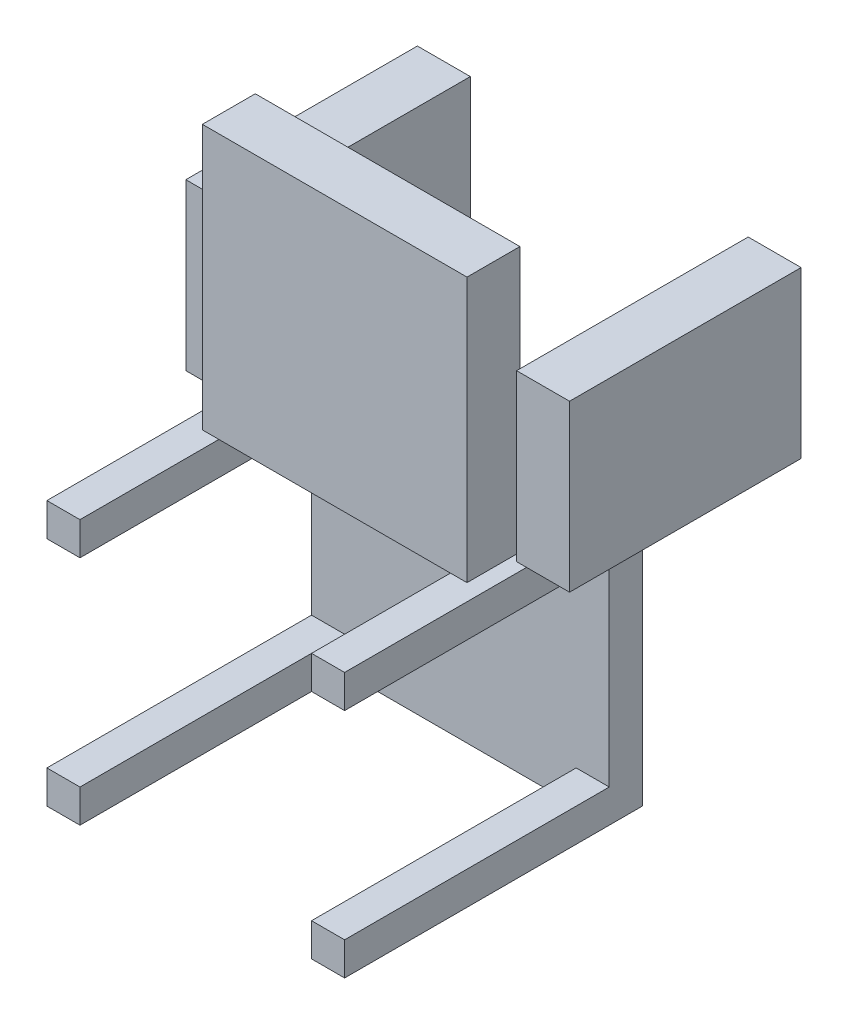
ISO-10303-21;
HEADER;
FILE_DESCRIPTION(('STEP AP214'),'2;1');
FILE_NAME('part.step','',(''),(''),'','','');
FILE_SCHEMA(('AUTOMOTIVE_DESIGN { 1 0 10303 214 1 1 1 1 }'));
ENDSEC;
DATA;
#1=APPLICATION_CONTEXT('core data for automotive mechanical design processes');
#2=APPLICATION_PROTOCOL_DEFINITION('international standard','automotive_design',2000,#1);
#3=PRODUCT_CONTEXT('',#1,'mechanical');
#4=PRODUCT('Part','Part','',(#3));
#5=PRODUCT_RELATED_PRODUCT_CATEGORY('part','',(#4));
#6=PRODUCT_DEFINITION_FORMATION('','',#4);
#7=PRODUCT_DEFINITION_CONTEXT('part definition',#1,'design');
#8=PRODUCT_DEFINITION('design','',#6,#7);
#9=PRODUCT_DEFINITION_SHAPE('','',#8);
#10=(LENGTH_UNIT() NAMED_UNIT(*) SI_UNIT(.MILLI.,.METRE.));
#11=(NAMED_UNIT(*) PLANE_ANGLE_UNIT() SI_UNIT($,.RADIAN.));
#12=(NAMED_UNIT(*) SI_UNIT($,.STERADIAN.) SOLID_ANGLE_UNIT());
#13=UNCERTAINTY_MEASURE_WITH_UNIT(LENGTH_MEASURE(1.E-05),#10,'distance_accuracy_value','');
#14=(GEOMETRIC_REPRESENTATION_CONTEXT(3) GLOBAL_UNCERTAINTY_ASSIGNED_CONTEXT((#13)) GLOBAL_UNIT_ASSIGNED_CONTEXT((#10,
#11,#12)) REPRESENTATION_CONTEXT('',''));
#15=CARTESIAN_POINT('',(0.,0.,0.));
#16=DIRECTION('',(0.,0.,1.));
#17=DIRECTION('',(1.,0.,0.));
#18=AXIS2_PLACEMENT_3D('',#15,#16,#17);
#19=CARTESIAN_POINT('',(-225.,200.,50.));
#20=DIRECTION('',(0.,-1.,0.));
#21=DIRECTION('',(0.,0.,-1.));
#22=AXIS2_PLACEMENT_3D('',#19,#20,#21);
#23=PLANE('',#22);
#24=DIRECTION('',(0.,0.,1.));
#25=VECTOR('',#24,1.);
#26=CARTESIAN_POINT('',(210.,200.,175.));
#27=LINE('',#26,#25);
#28=CARTESIAN_POINT('',(210.,200.,0.));
#29=VERTEX_POINT('',#28);
#30=CARTESIAN_POINT('',(210.,200.,175.));
#31=VERTEX_POINT('',#30);
#32=EDGE_CURVE('E800',#29,#31,#27,.T.);
#33=ORIENTED_EDGE('',*,*,#32,.F.);
#34=DIRECTION('',(-1.,0.,0.));
#35=VECTOR('',#34,1.);
#36=CARTESIAN_POINT('',(-225.,200.,0.));
#37=LINE('',#36,#35);
#38=CARTESIAN_POINT('',(-210.,200.,0.));
#39=VERTEX_POINT('',#38);
#40=EDGE_CURVE('E474',#29,#39,#37,.T.);
#41=ORIENTED_EDGE('',*,*,#40,.T.);
#42=DIRECTION('',(0.,0.,-1.));
#43=VECTOR('',#42,1.);
#44=CARTESIAN_POINT('',(-210.,200.,175.));
#45=LINE('',#44,#43);
#46=CARTESIAN_POINT('',(-210.,200.,175.));
#47=VERTEX_POINT('',#46);
#48=EDGE_CURVE('E297',#47,#39,#45,.T.);
#49=ORIENTED_EDGE('',*,*,#48,.F.);
#50=DIRECTION('',(1.,0.,0.));
#51=VECTOR('',#50,1.);
#52=CARTESIAN_POINT('',(-290.,200.,175.));
#53=LINE('',#52,#51);
#54=CARTESIAN_POINT('',(-225.,200.,175.));
#55=VERTEX_POINT('',#54);
#56=EDGE_CURVE('E304',#55,#47,#53,.T.);
#57=ORIENTED_EDGE('',*,*,#56,.F.);
#58=DIRECTION('',(0.,0.,-1.));
#59=VECTOR('',#58,1.);
#60=CARTESIAN_POINT('',(-225.,200.,50.));
#61=LINE('',#60,#59);
#62=CARTESIAN_POINT('',(-225.,200.,450.));
#63=VERTEX_POINT('',#62);
#64=EDGE_CURVE('E481',#63,#55,#61,.T.);
#65=ORIENTED_EDGE('',*,*,#64,.F.);
#66=DIRECTION('',(-1.,0.,0.));
#67=VECTOR('',#66,1.);
#68=CARTESIAN_POINT('',(-225.,200.,450.));
#69=LINE('',#68,#67);
#70=CARTESIAN_POINT('',(-175.,200.,450.));
#71=VERTEX_POINT('',#70);
#72=EDGE_CURVE('E382',#71,#63,#69,.T.);
#73=ORIENTED_EDGE('',*,*,#72,.F.);
#74=DIRECTION('',(0.,0.,-1.));
#75=VECTOR('',#74,1.);
#76=CARTESIAN_POINT('',(-175.,200.,450.));
#77=LINE('',#76,#75);
#78=CARTESIAN_POINT('',(-175.,200.,240.));
#79=VERTEX_POINT('',#78);
#80=EDGE_CURVE('E396',#71,#79,#77,.T.);
#81=ORIENTED_EDGE('',*,*,#80,.T.);
#82=DIRECTION('',(1.,0.,0.));
#83=VECTOR('',#82,1.);
#84=CARTESIAN_POINT('',(-200.,200.,240.));
#85=LINE('',#84,#83);
#86=CARTESIAN_POINT('',(-200.,200.,240.));
#87=VERTEX_POINT('',#86);
#88=EDGE_CURVE('E52',#87,#79,#85,.T.);
#89=ORIENTED_EDGE('',*,*,#88,.F.);
#90=DIRECTION('',(0.,0.,1.));
#91=VECTOR('',#90,1.);
#92=CARTESIAN_POINT('',(-200.,200.,240.));
#93=LINE('',#92,#91);
#94=CARTESIAN_POINT('',(-200.,200.,160.));
#95=VERTEX_POINT('',#94);
#96=EDGE_CURVE('E338',#95,#87,#93,.T.);
#97=ORIENTED_EDGE('',*,*,#96,.F.);
#98=DIRECTION('',(-1.,0.,0.));
#99=VECTOR('',#98,1.);
#100=CARTESIAN_POINT('',(-200.,200.,160.));
#101=LINE('',#100,#99);
#102=CARTESIAN_POINT('',(-175.,200.,160.));
#103=VERTEX_POINT('',#102);
#104=EDGE_CURVE('E50',#103,#95,#101,.T.);
#105=ORIENTED_EDGE('',*,*,#104,.F.);
#106=CARTESIAN_POINT('',(-175.,200.,50.));
#107=VERTEX_POINT('',#106);
#108=EDGE_CURVE('E395',#103,#107,#77,.T.);
#109=ORIENTED_EDGE('',*,*,#108,.T.);
#110=DIRECTION('',(-1.,0.,0.));
#111=VECTOR('',#110,1.);
#112=CARTESIAN_POINT('',(-225.,200.,50.));
#113=LINE('',#112,#111);
#114=CARTESIAN_POINT('',(175.,200.,50.));
#115=VERTEX_POINT('',#114);
#116=EDGE_CURVE('E459',#115,#107,#113,.T.);
#117=ORIENTED_EDGE('',*,*,#116,.F.);
#118=DIRECTION('',(0.,0.,-1.));
#119=VECTOR('',#118,1.);
#120=CARTESIAN_POINT('',(175.,200.,450.));
#121=LINE('',#120,#119);
#122=CARTESIAN_POINT('',(175.,200.,160.));
#123=VERTEX_POINT('',#122);
#124=EDGE_CURVE('E368',#123,#115,#121,.T.);
#125=ORIENTED_EDGE('',*,*,#124,.F.);
#126=CARTESIAN_POINT('',(200.,200.,160.));
#127=VERTEX_POINT('',#126);
#128=EDGE_CURVE('E335',#127,#123,#101,.T.);
#129=ORIENTED_EDGE('',*,*,#128,.F.);
#130=DIRECTION('',(0.,0.,-1.));
#131=VECTOR('',#130,1.);
#132=CARTESIAN_POINT('',(200.,200.,240.));
#133=LINE('',#132,#131);
#134=CARTESIAN_POINT('',(200.,200.,240.));
#135=VERTEX_POINT('',#134);
#136=EDGE_CURVE('E321',#135,#127,#133,.T.);
#137=ORIENTED_EDGE('',*,*,#136,.F.);
#138=CARTESIAN_POINT('',(175.,200.,240.));
#139=VERTEX_POINT('',#138);
#140=EDGE_CURVE('E11',#139,#135,#85,.T.);
#141=ORIENTED_EDGE('',*,*,#140,.F.);
#142=CARTESIAN_POINT('',(175.,200.,450.));
#143=VERTEX_POINT('',#142);
#144=EDGE_CURVE('E369',#143,#139,#121,.T.);
#145=ORIENTED_EDGE('',*,*,#144,.F.);
#146=DIRECTION('',(-1.,0.,0.));
#147=VECTOR('',#146,1.);
#148=CARTESIAN_POINT('',(175.,200.,450.));
#149=LINE('',#148,#147);
#150=CARTESIAN_POINT('',(225.,200.,450.));
#151=VERTEX_POINT('',#150);
#152=EDGE_CURVE('E356',#151,#143,#149,.T.);
#153=ORIENTED_EDGE('',*,*,#152,.F.);
#154=DIRECTION('',(0.,0.,-1.));
#155=VECTOR('',#154,1.);
#156=CARTESIAN_POINT('',(225.,200.,50.));
#157=LINE('',#156,#155);
#158=CARTESIAN_POINT('',(225.,200.,175.));
#159=VERTEX_POINT('',#158);
#160=EDGE_CURVE('E45',#151,#159,#157,.T.);
#161=ORIENTED_EDGE('',*,*,#160,.T.);
#162=DIRECTION('',(1.,0.,0.));
#163=VECTOR('',#162,1.);
#164=CARTESIAN_POINT('',(210.,200.,175.));
#165=LINE('',#164,#163);
#166=EDGE_CURVE('E60',#31,#159,#165,.T.);
#167=ORIENTED_EDGE('',*,*,#166,.F.);
#168=EDGE_LOOP('',(#33,#41,#49,#57,#65,#73,#81,#89,#97,#105,#109,#117,#125,#129,#137,#141,#145,
#153,#161,#167));
#169=FACE_BOUND('',#168,.T.);
#170=ADVANCED_FACE('F41',(#169),#23,.F.);
#171=CARTESIAN_POINT('',(0.,0.,50.));
#172=DIRECTION('',(0.,0.,-1.));
#173=DIRECTION('',(-1.,0.,0.));
#174=AXIS2_PLACEMENT_3D('',#171,#172,#173);
#175=PLANE('',#174);
#176=DIRECTION('',(0.,-1.,0.));
#177=VECTOR('',#176,1.);
#178=CARTESIAN_POINT('',(175.,0.,50.));
#179=LINE('',#178,#177);
#180=CARTESIAN_POINT('',(175.,150.,50.));
#181=VERTEX_POINT('',#180);
#182=EDGE_CURVE('E376',#115,#181,#179,.T.);
#183=ORIENTED_EDGE('',*,*,#182,.F.);
#184=ORIENTED_EDGE('',*,*,#116,.T.);
#185=DIRECTION('',(0.,1.,0.));
#186=VECTOR('',#185,1.);
#187=CARTESIAN_POINT('',(-175.,0.,50.));
#188=LINE('',#187,#186);
#189=CARTESIAN_POINT('',(-175.,150.,50.));
#190=VERTEX_POINT('',#189);
#191=EDGE_CURVE('E403',#190,#107,#188,.T.);
#192=ORIENTED_EDGE('',*,*,#191,.F.);
#193=DIRECTION('',(1.,0.,0.));
#194=VECTOR('',#193,1.);
#195=CARTESIAN_POINT('',(0.,150.,50.));
#196=LINE('',#195,#194);
#197=CARTESIAN_POINT('',(-225.,150.,50.));
#198=VERTEX_POINT('',#197);
#199=EDGE_CURVE('E399',#198,#190,#196,.T.);
#200=ORIENTED_EDGE('',*,*,#199,.F.);
#201=DIRECTION('',(0.,-1.,0.));
#202=VECTOR('',#201,1.);
#203=CARTESIAN_POINT('',(-225.,-200.,50.));
#204=LINE('',#203,#202);
#205=CARTESIAN_POINT('',(-225.,-150.,50.));
#206=VERTEX_POINT('',#205);
#207=EDGE_CURVE('E463',#198,#206,#204,.T.);
#208=ORIENTED_EDGE('',*,*,#207,.T.);
#209=DIRECTION('',(-1.,0.,0.));
#210=VECTOR('',#209,1.);
#211=CARTESIAN_POINT('',(0.,-150.,50.));
#212=LINE('',#211,#210);
#213=CARTESIAN_POINT('',(-175.,-150.,50.));
#214=VERTEX_POINT('',#213);
#215=EDGE_CURVE('E450',#214,#206,#212,.T.);
#216=ORIENTED_EDGE('',*,*,#215,.F.);
#217=DIRECTION('',(0.,1.,0.));
#218=VECTOR('',#217,1.);
#219=CARTESIAN_POINT('',(-175.,0.,50.));
#220=LINE('',#219,#218);
#221=CARTESIAN_POINT('',(-175.,-200.,50.));
#222=VERTEX_POINT('',#221);
#223=EDGE_CURVE('E453',#222,#214,#220,.T.);
#224=ORIENTED_EDGE('',*,*,#223,.F.);
#225=DIRECTION('',(1.,0.,0.));
#226=VECTOR('',#225,1.);
#227=CARTESIAN_POINT('',(-225.,-200.,50.));
#228=LINE('',#227,#226);
#229=CARTESIAN_POINT('',(175.,-200.,50.));
#230=VERTEX_POINT('',#229);
#231=EDGE_CURVE('E465',#222,#230,#228,.T.);
#232=ORIENTED_EDGE('',*,*,#231,.T.);
#233=DIRECTION('',(0.,-1.,0.));
#234=VECTOR('',#233,1.);
#235=CARTESIAN_POINT('',(175.,0.,50.));
#236=LINE('',#235,#234);
#237=CARTESIAN_POINT('',(175.,-150.,50.));
#238=VERTEX_POINT('',#237);
#239=EDGE_CURVE('E425',#238,#230,#236,.T.);
#240=ORIENTED_EDGE('',*,*,#239,.F.);
#241=DIRECTION('',(-1.,0.,0.));
#242=VECTOR('',#241,1.);
#243=CARTESIAN_POINT('',(0.,-150.,50.));
#244=LINE('',#243,#242);
#245=CARTESIAN_POINT('',(225.,-150.,50.));
#246=VERTEX_POINT('',#245);
#247=EDGE_CURVE('E428',#246,#238,#244,.T.);
#248=ORIENTED_EDGE('',*,*,#247,.F.);
#249=DIRECTION('',(0.,1.,0.));
#250=VECTOR('',#249,1.);
#251=CARTESIAN_POINT('',(225.,-200.,50.));
#252=LINE('',#251,#250);
#253=CARTESIAN_POINT('',(225.,150.,50.));
#254=VERTEX_POINT('',#253);
#255=EDGE_CURVE('E457',#246,#254,#252,.T.);
#256=ORIENTED_EDGE('',*,*,#255,.T.);
#257=DIRECTION('',(1.,0.,0.));
#258=VECTOR('',#257,1.);
#259=CARTESIAN_POINT('',(0.,150.,50.));
#260=LINE('',#259,#258);
#261=EDGE_CURVE('E372',#181,#254,#260,.T.);
#262=ORIENTED_EDGE('',*,*,#261,.F.);
#263=EDGE_LOOP('',(#183,#184,#192,#200,#208,#216,#224,#232,#240,#248,#256,#262));
#264=FACE_BOUND('',#263,.T.);
#265=ADVANCED_FACE('F507',(#264),#175,.F.);
#266=CARTESIAN_POINT('',(225.,-200.,50.));
#267=DIRECTION('',(-1.,0.,0.));
#268=DIRECTION('',(0.,0.,1.));
#269=AXIS2_PLACEMENT_3D('',#266,#267,#268);
#270=PLANE('',#269);
#271=ORIENTED_EDGE('',*,*,#160,.F.);
#272=DIRECTION('',(0.,1.,0.));
#273=VECTOR('',#272,1.);
#274=CARTESIAN_POINT('',(225.,150.,450.));
#275=LINE('',#274,#273);
#276=CARTESIAN_POINT('',(225.,150.,450.));
#277=VERTEX_POINT('',#276);
#278=EDGE_CURVE('E353',#277,#151,#275,.T.);
#279=ORIENTED_EDGE('',*,*,#278,.F.);
#280=DIRECTION('',(0.,0.,-1.));
#281=VECTOR('',#280,1.);
#282=CARTESIAN_POINT('',(225.,150.,450.));
#283=LINE('',#282,#281);
#284=EDGE_CURVE('E362',#277,#254,#283,.T.);
#285=ORIENTED_EDGE('',*,*,#284,.T.);
#286=ORIENTED_EDGE('',*,*,#255,.F.);
#287=DIRECTION('',(0.,0.,-1.));
#288=VECTOR('',#287,1.);
#289=CARTESIAN_POINT('',(225.,-150.,450.));
#290=LINE('',#289,#288);
#291=CARTESIAN_POINT('',(225.,-150.,450.));
#292=VERTEX_POINT('',#291);
#293=EDGE_CURVE('E422',#292,#246,#290,.T.);
#294=ORIENTED_EDGE('',*,*,#293,.F.);
#295=DIRECTION('',(0.,1.,0.));
#296=VECTOR('',#295,1.);
#297=CARTESIAN_POINT('',(225.,-200.,450.));
#298=LINE('',#297,#296);
#299=CARTESIAN_POINT('',(225.,-200.,450.));
#300=VERTEX_POINT('',#299);
#301=EDGE_CURVE('E406',#300,#292,#298,.T.);
#302=ORIENTED_EDGE('',*,*,#301,.F.);
#303=DIRECTION('',(0.,0.,-1.));
#304=VECTOR('',#303,1.);
#305=CARTESIAN_POINT('',(225.,-200.,50.));
#306=LINE('',#305,#304);
#307=CARTESIAN_POINT('',(225.,-200.,0.));
#308=VERTEX_POINT('',#307);
#309=EDGE_CURVE('E467',#300,#308,#306,.T.);
#310=ORIENTED_EDGE('',*,*,#309,.T.);
#311=DIRECTION('',(0.,1.,0.));
#312=VECTOR('',#311,1.);
#313=CARTESIAN_POINT('',(225.,-200.,0.));
#314=LINE('',#313,#312);
#315=CARTESIAN_POINT('',(225.,200.,0.));
#316=VERTEX_POINT('',#315);
#317=EDGE_CURVE('E456',#308,#316,#314,.T.);
#318=ORIENTED_EDGE('',*,*,#317,.T.);
#319=DIRECTION('',(0.,0.,1.));
#320=VECTOR('',#319,1.);
#321=CARTESIAN_POINT('',(225.,200.,50.));
#322=LINE('',#321,#320);
#323=EDGE_CURVE('E68',#316,#159,#322,.T.);
#324=ORIENTED_EDGE('',*,*,#323,.T.);
#325=EDGE_LOOP('',(#271,#279,#285,#286,#294,#302,#310,#318,#324));
#326=FACE_BOUND('',#325,.T.);
#327=ADVANCED_FACE('F43',(#326),#270,.F.);
#328=CARTESIAN_POINT('',(-225.,-200.,50.));
#329=DIRECTION('',(1.,0.,0.));
#330=DIRECTION('',(0.,0.,-1.));
#331=AXIS2_PLACEMENT_3D('',#328,#329,#330);
#332=PLANE('',#331);
#333=DIRECTION('',(0.,-1.,0.));
#334=VECTOR('',#333,1.);
#335=CARTESIAN_POINT('',(-225.,-200.,0.));
#336=LINE('',#335,#334);
#337=CARTESIAN_POINT('',(-225.,200.,0.));
#338=VERTEX_POINT('',#337);
#339=CARTESIAN_POINT('',(-225.,-200.,0.));
#340=VERTEX_POINT('',#339);
#341=EDGE_CURVE('E473',#338,#340,#336,.T.);
#342=ORIENTED_EDGE('',*,*,#341,.T.);
#343=DIRECTION('',(0.,0.,-1.));
#344=VECTOR('',#343,1.);
#345=CARTESIAN_POINT('',(-225.,-200.,50.));
#346=LINE('',#345,#344);
#347=CARTESIAN_POINT('',(-225.,-200.,450.));
#348=VERTEX_POINT('',#347);
#349=EDGE_CURVE('E479',#348,#340,#346,.T.);
#350=ORIENTED_EDGE('',*,*,#349,.F.);
#351=DIRECTION('',(0.,-1.,0.));
#352=VECTOR('',#351,1.);
#353=CARTESIAN_POINT('',(-225.,-200.,450.));
#354=LINE('',#353,#352);
#355=CARTESIAN_POINT('',(-225.,-150.,450.));
#356=VERTEX_POINT('',#355);
#357=EDGE_CURVE('E436',#356,#348,#354,.T.);
#358=ORIENTED_EDGE('',*,*,#357,.F.);
#359=DIRECTION('',(0.,0.,-1.));
#360=VECTOR('',#359,1.);
#361=CARTESIAN_POINT('',(-225.,-150.,450.));
#362=LINE('',#361,#360);
#363=EDGE_CURVE('E444',#356,#206,#362,.T.);
#364=ORIENTED_EDGE('',*,*,#363,.T.);
#365=ORIENTED_EDGE('',*,*,#207,.F.);
#366=DIRECTION('',(0.,0.,-1.));
#367=VECTOR('',#366,1.);
#368=CARTESIAN_POINT('',(-225.,150.,450.));
#369=LINE('',#368,#367);
#370=CARTESIAN_POINT('',(-225.,150.,450.));
#371=VERTEX_POINT('',#370);
#372=EDGE_CURVE('E392',#371,#198,#369,.T.);
#373=ORIENTED_EDGE('',*,*,#372,.F.);
#374=DIRECTION('',(0.,-1.,0.));
#375=VECTOR('',#374,1.);
#376=CARTESIAN_POINT('',(-225.,150.,450.));
#377=LINE('',#376,#375);
#378=EDGE_CURVE('E385',#63,#371,#377,.T.);
#379=ORIENTED_EDGE('',*,*,#378,.F.);
#380=ORIENTED_EDGE('',*,*,#64,.T.);
#381=DIRECTION('',(0.,0.,-1.));
#382=VECTOR('',#381,1.);
#383=CARTESIAN_POINT('',(-225.,200.,50.));
#384=LINE('',#383,#382);
#385=EDGE_CURVE('E318',#55,#338,#384,.T.);
#386=ORIENTED_EDGE('',*,*,#385,.T.);
#387=EDGE_LOOP('',(#342,#350,#358,#364,#365,#373,#379,#380,#386));
#388=FACE_BOUND('',#387,.T.);
#389=ADVANCED_FACE('F516',(#388),#332,.F.);
#390=CARTESIAN_POINT('',(-225.,-200.,50.));
#391=DIRECTION('',(0.,1.,0.));
#392=DIRECTION('',(0.,0.,1.));
#393=AXIS2_PLACEMENT_3D('',#390,#391,#392);
#394=PLANE('',#393);
#395=ORIENTED_EDGE('',*,*,#309,.F.);
#396=DIRECTION('',(1.,0.,0.));
#397=VECTOR('',#396,1.);
#398=CARTESIAN_POINT('',(175.,-200.,450.));
#399=LINE('',#398,#397);
#400=CARTESIAN_POINT('',(175.,-200.,450.));
#401=VERTEX_POINT('',#400);
#402=EDGE_CURVE('E413',#401,#300,#399,.T.);
#403=ORIENTED_EDGE('',*,*,#402,.F.);
#404=DIRECTION('',(0.,0.,-1.));
#405=VECTOR('',#404,1.);
#406=CARTESIAN_POINT('',(175.,-200.,450.));
#407=LINE('',#406,#405);
#408=EDGE_CURVE('E416',#401,#230,#407,.T.);
#409=ORIENTED_EDGE('',*,*,#408,.T.);
#410=ORIENTED_EDGE('',*,*,#231,.F.);
#411=DIRECTION('',(0.,0.,-1.));
#412=VECTOR('',#411,1.);
#413=CARTESIAN_POINT('',(-175.,-200.,450.));
#414=LINE('',#413,#412);
#415=CARTESIAN_POINT('',(-175.,-200.,450.));
#416=VERTEX_POINT('',#415);
#417=EDGE_CURVE('E441',#416,#222,#414,.T.);
#418=ORIENTED_EDGE('',*,*,#417,.F.);
#419=DIRECTION('',(1.,0.,0.));
#420=VECTOR('',#419,1.);
#421=CARTESIAN_POINT('',(-225.,-200.,450.));
#422=LINE('',#421,#420);
#423=EDGE_CURVE('E439',#348,#416,#422,.T.);
#424=ORIENTED_EDGE('',*,*,#423,.F.);
#425=ORIENTED_EDGE('',*,*,#349,.T.);
#426=DIRECTION('',(1.,0.,0.));
#427=VECTOR('',#426,1.);
#428=CARTESIAN_POINT('',(-225.,-200.,0.));
#429=LINE('',#428,#427);
#430=EDGE_CURVE('E460',#340,#308,#429,.T.);
#431=ORIENTED_EDGE('',*,*,#430,.T.);
#432=EDGE_LOOP('',(#395,#403,#409,#410,#418,#424,#425,#431));
#433=FACE_BOUND('',#432,.T.);
#434=ADVANCED_FACE('F529',(#433),#394,.F.);
#435=CARTESIAN_POINT('',(0.,0.,0.));
#436=DIRECTION('',(0.,0.,-1.));
#437=DIRECTION('',(-1.,0.,0.));
#438=AXIS2_PLACEMENT_3D('',#435,#436,#437);
#439=PLANE('',#438);
#440=ORIENTED_EDGE('',*,*,#341,.F.);
#441=EDGE_CURVE('E469',#39,#338,#37,.T.);
#442=ORIENTED_EDGE('',*,*,#441,.F.);
#443=ORIENTED_EDGE('',*,*,#40,.F.);
#444=EDGE_CURVE('E470',#316,#29,#37,.T.);
#445=ORIENTED_EDGE('',*,*,#444,.F.);
#446=ORIENTED_EDGE('',*,*,#317,.F.);
#447=ORIENTED_EDGE('',*,*,#430,.F.);
#448=EDGE_LOOP('',(#440,#442,#443,#445,#446,#447));
#449=FACE_BOUND('',#448,.T.);
#450=ADVANCED_FACE('F583',(#449),#439,.T.);
#451=CARTESIAN_POINT('',(-175.,-200.,450.));
#452=DIRECTION('',(-1.,0.,0.));
#453=DIRECTION('',(0.,0.,1.));
#454=AXIS2_PLACEMENT_3D('',#451,#452,#453);
#455=PLANE('',#454);
#456=ORIENTED_EDGE('',*,*,#417,.T.);
#457=ORIENTED_EDGE('',*,*,#223,.T.);
#458=DIRECTION('',(0.,0.,-1.));
#459=VECTOR('',#458,1.);
#460=CARTESIAN_POINT('',(-175.,-150.,450.));
#461=LINE('',#460,#459);
#462=CARTESIAN_POINT('',(-175.,-150.,450.));
#463=VERTEX_POINT('',#462);
#464=EDGE_CURVE('E447',#463,#214,#461,.T.);
#465=ORIENTED_EDGE('',*,*,#464,.F.);
#466=DIRECTION('',(0.,1.,0.));
#467=VECTOR('',#466,1.);
#468=CARTESIAN_POINT('',(-175.,-200.,450.));
#469=LINE('',#468,#467);
#470=EDGE_CURVE('E431',#416,#463,#469,.T.);
#471=ORIENTED_EDGE('',*,*,#470,.F.);
#472=EDGE_LOOP('',(#456,#457,#465,#471));
#473=FACE_BOUND('',#472,.T.);
#474=ADVANCED_FACE('F524',(#473),#455,.F.);
#475=CARTESIAN_POINT('',(-225.,-150.,450.));
#476=DIRECTION('',(0.,-1.,0.));
#477=DIRECTION('',(0.,0.,-1.));
#478=AXIS2_PLACEMENT_3D('',#475,#476,#477);
#479=PLANE('',#478);
#480=ORIENTED_EDGE('',*,*,#464,.T.);
#481=ORIENTED_EDGE('',*,*,#215,.T.);
#482=ORIENTED_EDGE('',*,*,#363,.F.);
#483=DIRECTION('',(-1.,0.,0.));
#484=VECTOR('',#483,1.);
#485=CARTESIAN_POINT('',(-225.,-150.,450.));
#486=LINE('',#485,#484);
#487=EDGE_CURVE('E434',#463,#356,#486,.T.);
#488=ORIENTED_EDGE('',*,*,#487,.F.);
#489=EDGE_LOOP('',(#480,#481,#482,#488));
#490=FACE_BOUND('',#489,.T.);
#491=ADVANCED_FACE('F520',(#490),#479,.F.);
#492=CARTESIAN_POINT('',(0.,0.,450.));
#493=DIRECTION('',(0.,0.,-1.));
#494=DIRECTION('',(-1.,0.,0.));
#495=AXIS2_PLACEMENT_3D('',#492,#493,#494);
#496=PLANE('',#495);
#497=ORIENTED_EDGE('',*,*,#470,.T.);
#498=ORIENTED_EDGE('',*,*,#487,.T.);
#499=ORIENTED_EDGE('',*,*,#357,.T.);
#500=ORIENTED_EDGE('',*,*,#423,.T.);
#501=EDGE_LOOP('',(#497,#498,#499,#500));
#502=FACE_BOUND('',#501,.T.);
#503=ADVANCED_FACE('F591',(#502),#496,.F.);
#504=CARTESIAN_POINT('',(175.,-150.,450.));
#505=DIRECTION('',(0.,-1.,0.));
#506=DIRECTION('',(0.,0.,-1.));
#507=AXIS2_PLACEMENT_3D('',#504,#505,#506);
#508=PLANE('',#507);
#509=ORIENTED_EDGE('',*,*,#293,.T.);
#510=ORIENTED_EDGE('',*,*,#247,.T.);
#511=DIRECTION('',(0.,0.,-1.));
#512=VECTOR('',#511,1.);
#513=CARTESIAN_POINT('',(175.,-150.,450.));
#514=LINE('',#513,#512);
#515=CARTESIAN_POINT('',(175.,-150.,450.));
#516=VERTEX_POINT('',#515);
#517=EDGE_CURVE('E419',#516,#238,#514,.T.);
#518=ORIENTED_EDGE('',*,*,#517,.F.);
#519=DIRECTION('',(-1.,0.,0.));
#520=VECTOR('',#519,1.);
#521=CARTESIAN_POINT('',(175.,-150.,450.));
#522=LINE('',#521,#520);
#523=EDGE_CURVE('E409',#292,#516,#522,.T.);
#524=ORIENTED_EDGE('',*,*,#523,.F.);
#525=EDGE_LOOP('',(#509,#510,#518,#524));
#526=FACE_BOUND('',#525,.T.);
#527=ADVANCED_FACE('F537',(#526),#508,.F.);
#528=CARTESIAN_POINT('',(175.,-200.,450.));
#529=DIRECTION('',(1.,0.,0.));
#530=DIRECTION('',(0.,0.,-1.));
#531=AXIS2_PLACEMENT_3D('',#528,#529,#530);
#532=PLANE('',#531);
#533=ORIENTED_EDGE('',*,*,#517,.T.);
#534=ORIENTED_EDGE('',*,*,#239,.T.);
#535=ORIENTED_EDGE('',*,*,#408,.F.);
#536=DIRECTION('',(0.,-1.,0.));
#537=VECTOR('',#536,1.);
#538=CARTESIAN_POINT('',(175.,-200.,450.));
#539=LINE('',#538,#537);
#540=EDGE_CURVE('E411',#516,#401,#539,.T.);
#541=ORIENTED_EDGE('',*,*,#540,.F.);
#542=EDGE_LOOP('',(#533,#534,#535,#541));
#543=FACE_BOUND('',#542,.T.);
#544=ADVANCED_FACE('F533',(#543),#532,.F.);
#545=CARTESIAN_POINT('',(0.,0.,450.));
#546=DIRECTION('',(0.,0.,-1.));
#547=DIRECTION('',(-1.,0.,0.));
#548=AXIS2_PLACEMENT_3D('',#545,#546,#547);
#549=PLANE('',#548);
#550=ORIENTED_EDGE('',*,*,#301,.T.);
#551=ORIENTED_EDGE('',*,*,#523,.T.);
#552=ORIENTED_EDGE('',*,*,#540,.T.);
#553=ORIENTED_EDGE('',*,*,#402,.T.);
#554=EDGE_LOOP('',(#550,#551,#552,#553));
#555=FACE_BOUND('',#554,.T.);
#556=ADVANCED_FACE('F599',(#555),#549,.F.);
#557=CARTESIAN_POINT('',(-175.,150.,450.));
#558=DIRECTION('',(-1.,0.,0.));
#559=DIRECTION('',(0.,0.,1.));
#560=AXIS2_PLACEMENT_3D('',#557,#558,#559);
#561=PLANE('',#560);
#562=DIRECTION('',(0.,0.,-1.));
#563=VECTOR('',#562,1.);
#564=CARTESIAN_POINT('',(-175.,150.,450.));
#565=LINE('',#564,#563);
#566=CARTESIAN_POINT('',(-175.,150.,450.));
#567=VERTEX_POINT('',#566);
#568=EDGE_CURVE('E389',#567,#190,#565,.T.);
#569=ORIENTED_EDGE('',*,*,#568,.T.);
#570=ORIENTED_EDGE('',*,*,#191,.T.);
#571=ORIENTED_EDGE('',*,*,#108,.F.);
#572=EDGE_CURVE('E400',#79,#103,#77,.T.);
#573=ORIENTED_EDGE('',*,*,#572,.F.);
#574=ORIENTED_EDGE('',*,*,#80,.F.);
#575=DIRECTION('',(0.,1.,0.));
#576=VECTOR('',#575,1.);
#577=CARTESIAN_POINT('',(-175.,150.,450.));
#578=LINE('',#577,#576);
#579=EDGE_CURVE('E379',#567,#71,#578,.T.);
#580=ORIENTED_EDGE('',*,*,#579,.F.);
#581=EDGE_LOOP('',(#569,#570,#571,#573,#574,#580));
#582=FACE_BOUND('',#581,.T.);
#583=ADVANCED_FACE('F508',(#582),#561,.F.);
#584=CARTESIAN_POINT('',(-225.,150.,450.));
#585=DIRECTION('',(0.,1.,0.));
#586=DIRECTION('',(0.,0.,1.));
#587=AXIS2_PLACEMENT_3D('',#584,#585,#586);
#588=PLANE('',#587);
#589=ORIENTED_EDGE('',*,*,#372,.T.);
#590=ORIENTED_EDGE('',*,*,#199,.T.);
#591=ORIENTED_EDGE('',*,*,#568,.F.);
#592=DIRECTION('',(1.,0.,0.));
#593=VECTOR('',#592,1.);
#594=CARTESIAN_POINT('',(-225.,150.,450.));
#595=LINE('',#594,#593);
#596=EDGE_CURVE('E387',#371,#567,#595,.T.);
#597=ORIENTED_EDGE('',*,*,#596,.F.);
#598=EDGE_LOOP('',(#589,#590,#591,#597));
#599=FACE_BOUND('',#598,.T.);
#600=ADVANCED_FACE('F513',(#599),#588,.F.);
#601=CARTESIAN_POINT('',(0.,0.,450.));
#602=DIRECTION('',(0.,0.,-1.));
#603=DIRECTION('',(-1.,0.,0.));
#604=AXIS2_PLACEMENT_3D('',#601,#602,#603);
#605=PLANE('',#604);
#606=ORIENTED_EDGE('',*,*,#579,.T.);
#607=ORIENTED_EDGE('',*,*,#72,.T.);
#608=ORIENTED_EDGE('',*,*,#378,.T.);
#609=ORIENTED_EDGE('',*,*,#596,.T.);
#610=EDGE_LOOP('',(#606,#607,#608,#609));
#611=FACE_BOUND('',#610,.T.);
#612=ADVANCED_FACE('F606',(#611),#605,.F.);
#613=CARTESIAN_POINT('',(175.,150.,450.));
#614=DIRECTION('',(1.,0.,0.));
#615=DIRECTION('',(0.,0.,-1.));
#616=AXIS2_PLACEMENT_3D('',#613,#614,#615);
#617=PLANE('',#616);
#618=ORIENTED_EDGE('',*,*,#144,.T.);
#619=EDGE_CURVE('E373',#139,#123,#121,.T.);
#620=ORIENTED_EDGE('',*,*,#619,.T.);
#621=ORIENTED_EDGE('',*,*,#124,.T.);
#622=ORIENTED_EDGE('',*,*,#182,.T.);
#623=DIRECTION('',(0.,0.,-1.));
#624=VECTOR('',#623,1.);
#625=CARTESIAN_POINT('',(175.,150.,450.));
#626=LINE('',#625,#624);
#627=CARTESIAN_POINT('',(175.,150.,450.));
#628=VERTEX_POINT('',#627);
#629=EDGE_CURVE('E365',#628,#181,#626,.T.);
#630=ORIENTED_EDGE('',*,*,#629,.F.);
#631=DIRECTION('',(0.,-1.,0.));
#632=VECTOR('',#631,1.);
#633=CARTESIAN_POINT('',(175.,150.,450.));
#634=LINE('',#633,#632);
#635=EDGE_CURVE('E358',#143,#628,#634,.T.);
#636=ORIENTED_EDGE('',*,*,#635,.F.);
#637=EDGE_LOOP('',(#618,#620,#621,#622,#630,#636));
#638=FACE_BOUND('',#637,.T.);
#639=ADVANCED_FACE('F548',(#638),#617,.F.);
#640=CARTESIAN_POINT('',(175.,150.,450.));
#641=DIRECTION('',(0.,1.,0.));
#642=DIRECTION('',(0.,0.,1.));
#643=AXIS2_PLACEMENT_3D('',#640,#641,#642);
#644=PLANE('',#643);
#645=ORIENTED_EDGE('',*,*,#629,.T.);
#646=ORIENTED_EDGE('',*,*,#261,.T.);
#647=ORIENTED_EDGE('',*,*,#284,.F.);
#648=DIRECTION('',(1.,0.,0.));
#649=VECTOR('',#648,1.);
#650=CARTESIAN_POINT('',(175.,150.,450.));
#651=LINE('',#650,#649);
#652=EDGE_CURVE('E360',#628,#277,#651,.T.);
#653=ORIENTED_EDGE('',*,*,#652,.F.);
#654=EDGE_LOOP('',(#645,#646,#647,#653));
#655=FACE_BOUND('',#654,.T.);
#656=ADVANCED_FACE('F545',(#655),#644,.F.);
#657=CARTESIAN_POINT('',(0.,0.,450.));
#658=DIRECTION('',(0.,0.,-1.));
#659=DIRECTION('',(-1.,0.,0.));
#660=AXIS2_PLACEMENT_3D('',#657,#658,#659);
#661=PLANE('',#660);
#662=ORIENTED_EDGE('',*,*,#278,.T.);
#663=ORIENTED_EDGE('',*,*,#152,.T.);
#664=ORIENTED_EDGE('',*,*,#635,.T.);
#665=ORIENTED_EDGE('',*,*,#652,.T.);
#666=EDGE_LOOP('',(#662,#663,#664,#665));
#667=FACE_BOUND('',#666,.T.);
#668=ADVANCED_FACE('F560',(#667),#661,.F.);
#669=CARTESIAN_POINT('',(0.,200.,0.));
#670=DIRECTION('',(0.,-1.,0.));
#671=DIRECTION('',(0.,0.,-1.));
#672=AXIS2_PLACEMENT_3D('',#669,#670,#671);
#673=PLANE('',#672);
#674=EDGE_CURVE('E53',#79,#139,#85,.T.);
#675=ORIENTED_EDGE('',*,*,#674,.F.);
#676=ORIENTED_EDGE('',*,*,#572,.T.);
#677=EDGE_CURVE('E334',#123,#103,#101,.T.);
#678=ORIENTED_EDGE('',*,*,#677,.F.);
#679=ORIENTED_EDGE('',*,*,#619,.F.);
#680=EDGE_LOOP('',(#675,#676,#678,#679));
#681=FACE_BOUND('',#680,.T.);
#682=ADVANCED_FACE('F498',(#681),#673,.T.);
#683=CARTESIAN_POINT('',(200.,600.,240.));
#684=DIRECTION('',(-1.,0.,0.));
#685=DIRECTION('',(0.,0.,1.));
#686=AXIS2_PLACEMENT_3D('',#683,#684,#685);
#687=PLANE('',#686);
#688=ORIENTED_EDGE('',*,*,#136,.T.);
#689=DIRECTION('',(0.,-1.,0.));
#690=VECTOR('',#689,1.);
#691=CARTESIAN_POINT('',(200.,600.,160.));
#692=LINE('',#691,#690);
#693=CARTESIAN_POINT('',(200.,600.,160.));
#694=VERTEX_POINT('',#693);
#695=EDGE_CURVE('E350',#694,#127,#692,.T.);
#696=ORIENTED_EDGE('',*,*,#695,.F.);
#697=DIRECTION('',(0.,0.,-1.));
#698=VECTOR('',#697,1.);
#699=CARTESIAN_POINT('',(200.,600.,240.));
#700=LINE('',#699,#698);
#701=CARTESIAN_POINT('',(200.,600.,240.));
#702=VERTEX_POINT('',#701);
#703=EDGE_CURVE('E322',#702,#694,#700,.T.);
#704=ORIENTED_EDGE('',*,*,#703,.F.);
#705=DIRECTION('',(0.,-1.,0.));
#706=VECTOR('',#705,1.);
#707=CARTESIAN_POINT('',(200.,600.,240.));
#708=LINE('',#707,#706);
#709=EDGE_CURVE('E331',#702,#135,#708,.T.);
#710=ORIENTED_EDGE('',*,*,#709,.T.);
#711=EDGE_LOOP('',(#688,#696,#704,#710));
#712=FACE_BOUND('',#711,.T.);
#713=ADVANCED_FACE('F553',(#712),#687,.F.);
#714=CARTESIAN_POINT('',(-200.,600.,160.));
#715=DIRECTION('',(0.,0.,1.));
#716=DIRECTION('',(1.,0.,0.));
#717=AXIS2_PLACEMENT_3D('',#714,#715,#716);
#718=PLANE('',#717);
#719=ORIENTED_EDGE('',*,*,#128,.T.);
#720=ORIENTED_EDGE('',*,*,#677,.T.);
#721=ORIENTED_EDGE('',*,*,#104,.T.);
#722=DIRECTION('',(0.,-1.,0.));
#723=VECTOR('',#722,1.);
#724=CARTESIAN_POINT('',(-200.,600.,160.));
#725=LINE('',#724,#723);
#726=CARTESIAN_POINT('',(-200.,600.,160.));
#727=VERTEX_POINT('',#726);
#728=EDGE_CURVE('E347',#727,#95,#725,.T.);
#729=ORIENTED_EDGE('',*,*,#728,.F.);
#730=DIRECTION('',(-1.,0.,0.));
#731=VECTOR('',#730,1.);
#732=CARTESIAN_POINT('',(-200.,600.,160.));
#733=LINE('',#732,#731);
#734=EDGE_CURVE('E325',#694,#727,#733,.T.);
#735=ORIENTED_EDGE('',*,*,#734,.F.);
#736=ORIENTED_EDGE('',*,*,#695,.T.);
#737=EDGE_LOOP('',(#719,#720,#721,#729,#735,#736));
#738=FACE_BOUND('',#737,.T.);
#739=ADVANCED_FACE('F493',(#738),#718,.F.);
#740=CARTESIAN_POINT('',(-200.,600.,240.));
#741=DIRECTION('',(1.,0.,0.));
#742=DIRECTION('',(0.,0.,-1.));
#743=AXIS2_PLACEMENT_3D('',#740,#741,#742);
#744=PLANE('',#743);
#745=ORIENTED_EDGE('',*,*,#96,.T.);
#746=DIRECTION('',(0.,-1.,0.));
#747=VECTOR('',#746,1.);
#748=CARTESIAN_POINT('',(-200.,600.,240.));
#749=LINE('',#748,#747);
#750=CARTESIAN_POINT('',(-200.,600.,240.));
#751=VERTEX_POINT('',#750);
#752=EDGE_CURVE('E344',#751,#87,#749,.T.);
#753=ORIENTED_EDGE('',*,*,#752,.F.);
#754=DIRECTION('',(0.,0.,1.));
#755=VECTOR('',#754,1.);
#756=CARTESIAN_POINT('',(-200.,600.,240.));
#757=LINE('',#756,#755);
#758=EDGE_CURVE('E327',#727,#751,#757,.T.);
#759=ORIENTED_EDGE('',*,*,#758,.F.);
#760=ORIENTED_EDGE('',*,*,#728,.T.);
#761=EDGE_LOOP('',(#745,#753,#759,#760));
#762=FACE_BOUND('',#761,.T.);
#763=ADVANCED_FACE('F635',(#762),#744,.F.);
#764=CARTESIAN_POINT('',(-200.,600.,240.));
#765=DIRECTION('',(0.,0.,-1.));
#766=DIRECTION('',(-1.,0.,0.));
#767=AXIS2_PLACEMENT_3D('',#764,#765,#766);
#768=PLANE('',#767);
#769=ORIENTED_EDGE('',*,*,#88,.T.);
#770=ORIENTED_EDGE('',*,*,#674,.T.);
#771=ORIENTED_EDGE('',*,*,#140,.T.);
#772=ORIENTED_EDGE('',*,*,#709,.F.);
#773=DIRECTION('',(1.,0.,0.));
#774=VECTOR('',#773,1.);
#775=CARTESIAN_POINT('',(-200.,600.,240.));
#776=LINE('',#775,#774);
#777=EDGE_CURVE('E329',#751,#702,#776,.T.);
#778=ORIENTED_EDGE('',*,*,#777,.F.);
#779=ORIENTED_EDGE('',*,*,#752,.T.);
#780=EDGE_LOOP('',(#769,#770,#771,#772,#778,#779));
#781=FACE_BOUND('',#780,.T.);
#782=ADVANCED_FACE('F557',(#781),#768,.F.);
#783=CARTESIAN_POINT('',(0.,600.,0.));
#784=DIRECTION('',(0.,-1.,0.));
#785=DIRECTION('',(0.,0.,-1.));
#786=AXIS2_PLACEMENT_3D('',#783,#784,#785);
#787=PLANE('',#786);
#788=ORIENTED_EDGE('',*,*,#703,.T.);
#789=ORIENTED_EDGE('',*,*,#734,.T.);
#790=ORIENTED_EDGE('',*,*,#758,.T.);
#791=ORIENTED_EDGE('',*,*,#777,.T.);
#792=EDGE_LOOP('',(#788,#789,#790,#791));
#793=FACE_BOUND('',#792,.T.);
#794=ADVANCED_FACE('F651',(#793),#787,.F.);
#795=CARTESIAN_POINT('',(0.,200.,0.));
#796=DIRECTION('',(0.,-1.,0.));
#797=DIRECTION('',(0.,0.,-1.));
#798=AXIS2_PLACEMENT_3D('',#795,#796,#797);
#799=PLANE('',#798);
#800=ORIENTED_EDGE('',*,*,#385,.F.);
#801=CARTESIAN_POINT('',(-290.,200.,175.));
#802=VERTEX_POINT('',#801);
#803=EDGE_CURVE('E290',#802,#55,#53,.T.);
#804=ORIENTED_EDGE('',*,*,#803,.F.);
#805=DIRECTION('',(0.,0.,1.));
#806=VECTOR('',#805,1.);
#807=CARTESIAN_POINT('',(-290.,200.,175.));
#808=LINE('',#807,#806);
#809=CARTESIAN_POINT('',(-290.,200.,-175.));
#810=VERTEX_POINT('',#809);
#811=EDGE_CURVE('E302',#810,#802,#808,.T.);
#812=ORIENTED_EDGE('',*,*,#811,.F.);
#813=DIRECTION('',(-1.,0.,0.));
#814=VECTOR('',#813,1.);
#815=CARTESIAN_POINT('',(-290.,200.,-175.));
#816=LINE('',#815,#814);
#817=CARTESIAN_POINT('',(-210.,200.,-175.));
#818=VERTEX_POINT('',#817);
#819=EDGE_CURVE('E300',#818,#810,#816,.T.);
#820=ORIENTED_EDGE('',*,*,#819,.F.);
#821=EDGE_CURVE('E280',#39,#818,#45,.T.);
#822=ORIENTED_EDGE('',*,*,#821,.F.);
#823=ORIENTED_EDGE('',*,*,#441,.T.);
#824=EDGE_LOOP('',(#800,#804,#812,#820,#822,#823));
#825=FACE_BOUND('',#824,.T.);
#826=ADVANCED_FACE('F658',(#825),#799,.T.);
#827=CARTESIAN_POINT('',(-210.,450.,175.));
#828=DIRECTION('',(-1.,0.,0.));
#829=DIRECTION('',(0.,0.,1.));
#830=AXIS2_PLACEMENT_3D('',#827,#828,#829);
#831=PLANE('',#830);
#832=ORIENTED_EDGE('',*,*,#48,.T.);
#833=ORIENTED_EDGE('',*,*,#821,.T.);
#834=DIRECTION('',(0.,-1.,0.));
#835=VECTOR('',#834,1.);
#836=CARTESIAN_POINT('',(-210.,450.,-175.));
#837=LINE('',#836,#835);
#838=CARTESIAN_POINT('',(-210.,450.,-175.));
#839=VERTEX_POINT('',#838);
#840=EDGE_CURVE('E315',#839,#818,#837,.T.);
#841=ORIENTED_EDGE('',*,*,#840,.F.);
#842=DIRECTION('',(0.,0.,-1.));
#843=VECTOR('',#842,1.);
#844=CARTESIAN_POINT('',(-210.,450.,175.));
#845=LINE('',#844,#843);
#846=CARTESIAN_POINT('',(-210.,450.,175.));
#847=VERTEX_POINT('',#846);
#848=EDGE_CURVE('E286',#847,#839,#845,.T.);
#849=ORIENTED_EDGE('',*,*,#848,.F.);
#850=DIRECTION('',(0.,-1.,0.));
#851=VECTOR('',#850,1.);
#852=CARTESIAN_POINT('',(-210.,450.,175.));
#853=LINE('',#852,#851);
#854=EDGE_CURVE('E296',#847,#47,#853,.T.);
#855=ORIENTED_EDGE('',*,*,#854,.T.);
#856=EDGE_LOOP('',(#832,#833,#841,#849,#855));
#857=FACE_BOUND('',#856,.T.);
#858=ADVANCED_FACE('F674',(#857),#831,.F.);
#859=CARTESIAN_POINT('',(-290.,450.,-175.));
#860=DIRECTION('',(0.,0.,1.));
#861=DIRECTION('',(1.,0.,0.));
#862=AXIS2_PLACEMENT_3D('',#859,#860,#861);
#863=PLANE('',#862);
#864=ORIENTED_EDGE('',*,*,#819,.T.);
#865=DIRECTION('',(0.,-1.,0.));
#866=VECTOR('',#865,1.);
#867=CARTESIAN_POINT('',(-290.,450.,-175.));
#868=LINE('',#867,#866);
#869=CARTESIAN_POINT('',(-290.,450.,-175.));
#870=VERTEX_POINT('',#869);
#871=EDGE_CURVE('E312',#870,#810,#868,.T.);
#872=ORIENTED_EDGE('',*,*,#871,.F.);
#873=DIRECTION('',(-1.,0.,0.));
#874=VECTOR('',#873,1.);
#875=CARTESIAN_POINT('',(-290.,450.,-175.));
#876=LINE('',#875,#874);
#877=EDGE_CURVE('E289',#839,#870,#876,.T.);
#878=ORIENTED_EDGE('',*,*,#877,.F.);
#879=ORIENTED_EDGE('',*,*,#840,.T.);
#880=EDGE_LOOP('',(#864,#872,#878,#879));
#881=FACE_BOUND('',#880,.T.);
#882=ADVANCED_FACE('F683',(#881),#863,.F.);
#883=CARTESIAN_POINT('',(-290.,450.,175.));
#884=DIRECTION('',(1.,0.,0.));
#885=DIRECTION('',(0.,0.,-1.));
#886=AXIS2_PLACEMENT_3D('',#883,#884,#885);
#887=PLANE('',#886);
#888=ORIENTED_EDGE('',*,*,#811,.T.);
#889=DIRECTION('',(0.,-1.,0.));
#890=VECTOR('',#889,1.);
#891=CARTESIAN_POINT('',(-290.,450.,175.));
#892=LINE('',#891,#890);
#893=CARTESIAN_POINT('',(-290.,450.,175.));
#894=VERTEX_POINT('',#893);
#895=EDGE_CURVE('E309',#894,#802,#892,.T.);
#896=ORIENTED_EDGE('',*,*,#895,.F.);
#897=DIRECTION('',(0.,0.,1.));
#898=VECTOR('',#897,1.);
#899=CARTESIAN_POINT('',(-290.,450.,175.));
#900=LINE('',#899,#898);
#901=EDGE_CURVE('E292',#870,#894,#900,.T.);
#902=ORIENTED_EDGE('',*,*,#901,.F.);
#903=ORIENTED_EDGE('',*,*,#871,.T.);
#904=EDGE_LOOP('',(#888,#896,#902,#903));
#905=FACE_BOUND('',#904,.T.);
#906=ADVANCED_FACE('F692',(#905),#887,.F.);
#907=CARTESIAN_POINT('',(-290.,450.,175.));
#908=DIRECTION('',(0.,0.,-1.));
#909=DIRECTION('',(-1.,0.,0.));
#910=AXIS2_PLACEMENT_3D('',#907,#908,#909);
#911=PLANE('',#910);
#912=ORIENTED_EDGE('',*,*,#803,.T.);
#913=ORIENTED_EDGE('',*,*,#56,.T.);
#914=ORIENTED_EDGE('',*,*,#854,.F.);
#915=DIRECTION('',(1.,0.,0.));
#916=VECTOR('',#915,1.);
#917=CARTESIAN_POINT('',(-290.,450.,175.));
#918=LINE('',#917,#916);
#919=EDGE_CURVE('E294',#894,#847,#918,.T.);
#920=ORIENTED_EDGE('',*,*,#919,.F.);
#921=ORIENTED_EDGE('',*,*,#895,.T.);
#922=EDGE_LOOP('',(#912,#913,#914,#920,#921));
#923=FACE_BOUND('',#922,.T.);
#924=ADVANCED_FACE('F701',(#923),#911,.F.);
#925=CARTESIAN_POINT('',(0.,450.,0.));
#926=DIRECTION('',(0.,-1.,0.));
#927=DIRECTION('',(0.,0.,-1.));
#928=AXIS2_PLACEMENT_3D('',#925,#926,#927);
#929=PLANE('',#928);
#930=ORIENTED_EDGE('',*,*,#848,.T.);
#931=ORIENTED_EDGE('',*,*,#877,.T.);
#932=ORIENTED_EDGE('',*,*,#901,.T.);
#933=ORIENTED_EDGE('',*,*,#919,.T.);
#934=EDGE_LOOP('',(#930,#931,#932,#933));
#935=FACE_BOUND('',#934,.T.);
#936=ADVANCED_FACE('F709',(#935),#929,.F.);
#937=CARTESIAN_POINT('',(0.,200.,0.));
#938=DIRECTION('',(0.,-1.,0.));
#939=DIRECTION('',(0.,0.,-1.));
#940=AXIS2_PLACEMENT_3D('',#937,#938,#939);
#941=PLANE('',#940);
#942=ORIENTED_EDGE('',*,*,#323,.F.);
#943=ORIENTED_EDGE('',*,*,#444,.T.);
#944=CARTESIAN_POINT('',(210.,200.,-175.));
#945=VERTEX_POINT('',#944);
#946=EDGE_CURVE('E791',#945,#29,#27,.T.);
#947=ORIENTED_EDGE('',*,*,#946,.F.);
#948=DIRECTION('',(-1.,0.,0.));
#949=VECTOR('',#948,1.);
#950=CARTESIAN_POINT('',(210.,200.,-175.));
#951=LINE('',#950,#949);
#952=CARTESIAN_POINT('',(290.,200.,-175.));
#953=VERTEX_POINT('',#952);
#954=EDGE_CURVE('E799',#953,#945,#951,.T.);
#955=ORIENTED_EDGE('',*,*,#954,.F.);
#956=DIRECTION('',(0.,0.,-1.));
#957=VECTOR('',#956,1.);
#958=CARTESIAN_POINT('',(290.,200.,175.));
#959=LINE('',#958,#957);
#960=CARTESIAN_POINT('',(290.,200.,175.));
#961=VERTEX_POINT('',#960);
#962=EDGE_CURVE('E278',#961,#953,#959,.T.);
#963=ORIENTED_EDGE('',*,*,#962,.F.);
#964=EDGE_CURVE('E788',#159,#961,#165,.T.);
#965=ORIENTED_EDGE('',*,*,#964,.F.);
#966=EDGE_LOOP('',(#942,#943,#947,#955,#963,#965));
#967=FACE_BOUND('',#966,.T.);
#968=ADVANCED_FACE('F717',(#967),#941,.T.);
#969=CARTESIAN_POINT('',(290.,450.,175.));
#970=DIRECTION('',(-1.,0.,0.));
#971=DIRECTION('',(0.,0.,1.));
#972=AXIS2_PLACEMENT_3D('',#969,#970,#971);
#973=PLANE('',#972);
#974=ORIENTED_EDGE('',*,*,#962,.T.);
#975=DIRECTION('',(0.,-1.,0.));
#976=VECTOR('',#975,1.);
#977=CARTESIAN_POINT('',(290.,450.,-175.));
#978=LINE('',#977,#976);
#979=CARTESIAN_POINT('',(290.,450.,-175.));
#980=VERTEX_POINT('',#979);
#981=EDGE_CURVE('E259',#980,#953,#978,.T.);
#982=ORIENTED_EDGE('',*,*,#981,.F.);
#983=DIRECTION('',(0.,0.,-1.));
#984=VECTOR('',#983,1.);
#985=CARTESIAN_POINT('',(290.,450.,175.));
#986=LINE('',#985,#984);
#987=CARTESIAN_POINT('',(290.,450.,175.));
#988=VERTEX_POINT('',#987);
#989=EDGE_CURVE('E266',#988,#980,#986,.T.);
#990=ORIENTED_EDGE('',*,*,#989,.F.);
#991=DIRECTION('',(0.,-1.,0.));
#992=VECTOR('',#991,1.);
#993=CARTESIAN_POINT('',(290.,450.,175.));
#994=LINE('',#993,#992);
#995=EDGE_CURVE('E795',#988,#961,#994,.T.);
#996=ORIENTED_EDGE('',*,*,#995,.T.);
#997=EDGE_LOOP('',(#974,#982,#990,#996));
#998=FACE_BOUND('',#997,.T.);
#999=ADVANCED_FACE('F276',(#998),#973,.F.);
#1000=CARTESIAN_POINT('',(210.,450.,-175.));
#1001=DIRECTION('',(0.,0.,1.));
#1002=DIRECTION('',(1.,0.,0.));
#1003=AXIS2_PLACEMENT_3D('',#1000,#1001,#1002);
#1004=PLANE('',#1003);
#1005=ORIENTED_EDGE('',*,*,#954,.T.);
#1006=DIRECTION('',(0.,-1.,0.));
#1007=VECTOR('',#1006,1.);
#1008=CARTESIAN_POINT('',(210.,450.,-175.));
#1009=LINE('',#1008,#1007);
#1010=CARTESIAN_POINT('',(210.,450.,-175.));
#1011=VERTEX_POINT('',#1010);
#1012=EDGE_CURVE('E262',#1011,#945,#1009,.T.);
#1013=ORIENTED_EDGE('',*,*,#1012,.F.);
#1014=DIRECTION('',(-1.,0.,0.));
#1015=VECTOR('',#1014,1.);
#1016=CARTESIAN_POINT('',(210.,450.,-175.));
#1017=LINE('',#1016,#1015);
#1018=EDGE_CURVE('E255',#980,#1011,#1017,.T.);
#1019=ORIENTED_EDGE('',*,*,#1018,.F.);
#1020=ORIENTED_EDGE('',*,*,#981,.T.);
#1021=EDGE_LOOP('',(#1005,#1013,#1019,#1020));
#1022=FACE_BOUND('',#1021,.T.);
#1023=ADVANCED_FACE('F257',(#1022),#1004,.F.);
#1024=CARTESIAN_POINT('',(210.,450.,175.));
#1025=DIRECTION('',(1.,0.,0.));
#1026=DIRECTION('',(0.,0.,-1.));
#1027=AXIS2_PLACEMENT_3D('',#1024,#1025,#1026);
#1028=PLANE('',#1027);
#1029=ORIENTED_EDGE('',*,*,#946,.T.);
#1030=ORIENTED_EDGE('',*,*,#32,.T.);
#1031=DIRECTION('',(0.,-1.,0.));
#1032=VECTOR('',#1031,1.);
#1033=CARTESIAN_POINT('',(210.,450.,175.));
#1034=LINE('',#1033,#1032);
#1035=CARTESIAN_POINT('',(210.,450.,175.));
#1036=VERTEX_POINT('',#1035);
#1037=EDGE_CURVE('E282',#1036,#31,#1034,.T.);
#1038=ORIENTED_EDGE('',*,*,#1037,.F.);
#1039=DIRECTION('',(0.,0.,1.));
#1040=VECTOR('',#1039,1.);
#1041=CARTESIAN_POINT('',(210.,450.,175.));
#1042=LINE('',#1041,#1040);
#1043=EDGE_CURVE('E265',#1011,#1036,#1042,.T.);
#1044=ORIENTED_EDGE('',*,*,#1043,.F.);
#1045=ORIENTED_EDGE('',*,*,#1012,.T.);
#1046=EDGE_LOOP('',(#1029,#1030,#1038,#1044,#1045));
#1047=FACE_BOUND('',#1046,.T.);
#1048=ADVANCED_FACE('F757',(#1047),#1028,.F.);
#1049=CARTESIAN_POINT('',(210.,450.,175.));
#1050=DIRECTION('',(0.,0.,-1.));
#1051=DIRECTION('',(-1.,0.,0.));
#1052=AXIS2_PLACEMENT_3D('',#1049,#1050,#1051);
#1053=PLANE('',#1052);
#1054=ORIENTED_EDGE('',*,*,#166,.T.);
#1055=ORIENTED_EDGE('',*,*,#964,.T.);
#1056=ORIENTED_EDGE('',*,*,#995,.F.);
#1057=DIRECTION('',(1.,0.,0.));
#1058=VECTOR('',#1057,1.);
#1059=CARTESIAN_POINT('',(210.,450.,175.));
#1060=LINE('',#1059,#1058);
#1061=EDGE_CURVE('E271',#1036,#988,#1060,.T.);
#1062=ORIENTED_EDGE('',*,*,#1061,.F.);
#1063=ORIENTED_EDGE('',*,*,#1037,.T.);
#1064=EDGE_LOOP('',(#1054,#1055,#1056,#1062,#1063));
#1065=FACE_BOUND('',#1064,.T.);
#1066=ADVANCED_FACE('F766',(#1065),#1053,.F.);
#1067=CARTESIAN_POINT('',(0.,450.,0.));
#1068=DIRECTION('',(0.,-1.,0.));
#1069=DIRECTION('',(0.,0.,-1.));
#1070=AXIS2_PLACEMENT_3D('',#1067,#1068,#1069);
#1071=PLANE('',#1070);
#1072=ORIENTED_EDGE('',*,*,#989,.T.);
#1073=ORIENTED_EDGE('',*,*,#1018,.T.);
#1074=ORIENTED_EDGE('',*,*,#1043,.T.);
#1075=ORIENTED_EDGE('',*,*,#1061,.T.);
#1076=EDGE_LOOP('',(#1072,#1073,#1074,#1075));
#1077=FACE_BOUND('',#1076,.T.);
#1078=ADVANCED_FACE('F269',(#1077),#1071,.F.);
#1079=CLOSED_SHELL('',(#170,#265,#327,#389,#434,#450,#474,#491,#503,#527,#544,#556,#583,#600,
#612,#639,#656,#668,#682,#713,#739,#763,#782,#794,#826,#858,#882,#906,#924,#936,#968,#999,#1023,
#1048,#1066,#1078));
#1080=MANIFOLD_SOLID_BREP('B2',#1079);
#1081=ADVANCED_BREP_SHAPE_REPRESENTATION('',(#18,#1080),#14);
#1082=SHAPE_DEFINITION_REPRESENTATION(#9,#1081);
ENDSEC;
END-ISO-10303-21;
